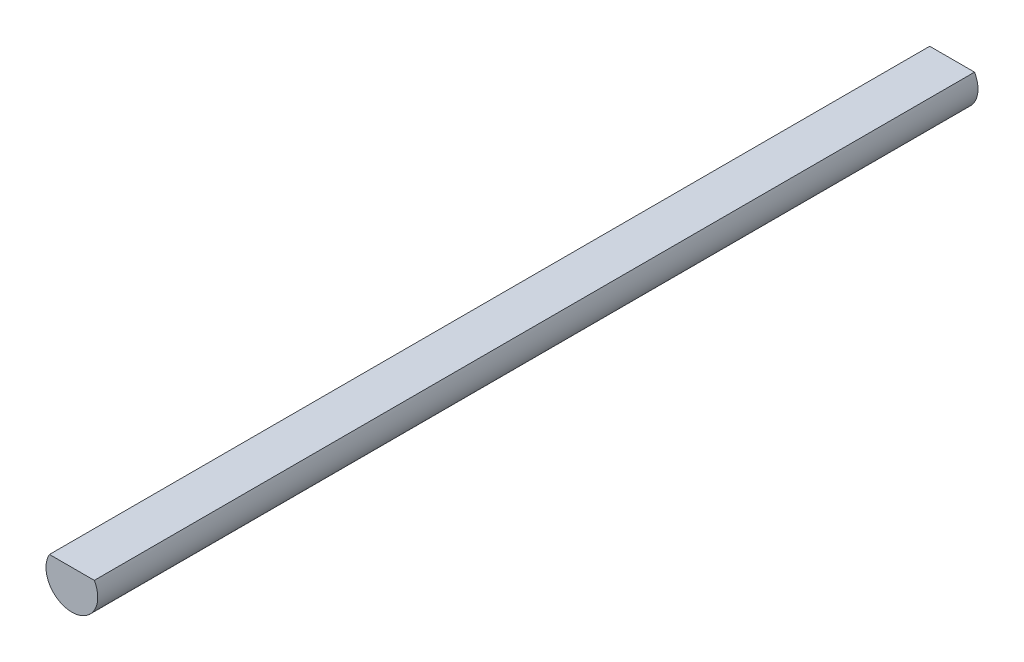
ISO-10303-21;
HEADER;
FILE_DESCRIPTION(('STEP AP214'),'2;1');
FILE_NAME('part.step','',(''),(''),'','','');
FILE_SCHEMA(('AUTOMOTIVE_DESIGN { 1 0 10303 214 1 1 1 1 }'));
ENDSEC;
DATA;
#1=APPLICATION_CONTEXT('core data for automotive mechanical design processes');
#2=APPLICATION_PROTOCOL_DEFINITION('international standard','automotive_design',2000,#1);
#3=PRODUCT_CONTEXT('',#1,'mechanical');
#4=PRODUCT('Part','Part','',(#3));
#5=PRODUCT_RELATED_PRODUCT_CATEGORY('part','',(#4));
#6=PRODUCT_DEFINITION_FORMATION('','',#4);
#7=PRODUCT_DEFINITION_CONTEXT('part definition',#1,'design');
#8=PRODUCT_DEFINITION('design','',#6,#7);
#9=PRODUCT_DEFINITION_SHAPE('','',#8);
#10=(LENGTH_UNIT() NAMED_UNIT(*) SI_UNIT(.MILLI.,.METRE.));
#11=(NAMED_UNIT(*) PLANE_ANGLE_UNIT() SI_UNIT($,.RADIAN.));
#12=(NAMED_UNIT(*) SI_UNIT($,.STERADIAN.) SOLID_ANGLE_UNIT());
#13=UNCERTAINTY_MEASURE_WITH_UNIT(LENGTH_MEASURE(1.E-05),#10,'distance_accuracy_value','');
#14=(GEOMETRIC_REPRESENTATION_CONTEXT(3) GLOBAL_UNCERTAINTY_ASSIGNED_CONTEXT((#13)) GLOBAL_UNIT_ASSIGNED_CONTEXT((#10,
#11,#12)) REPRESENTATION_CONTEXT('',''));
#15=CARTESIAN_POINT('',(0.,0.,0.));
#16=DIRECTION('',(0.,0.,1.));
#17=DIRECTION('',(1.,0.,0.));
#18=AXIS2_PLACEMENT_3D('',#15,#16,#17);
#19=CARTESIAN_POINT('',(-5.4991,3.17527938770748,215.9));
#20=DIRECTION('',(0.,1.,0.));
#21=DIRECTION('',(0.,0.,1.));
#22=AXIS2_PLACEMENT_3D('',#19,#20,#21);
#23=PLANE('',#22);
#24=DIRECTION('',(1.,0.,0.));
#25=VECTOR('',#24,1.);
#26=CARTESIAN_POINT('',(-5.4991,3.17527938770748,0.));
#27=LINE('',#26,#25);
#28=CARTESIAN_POINT('',(-5.4991,3.17527938770748,0.));
#29=VERTEX_POINT('',#28);
#30=CARTESIAN_POINT('',(5.4991,3.17527938770748,0.));
#31=VERTEX_POINT('',#30);
#32=EDGE_CURVE('E64',#29,#31,#27,.T.);
#33=ORIENTED_EDGE('',*,*,#32,.F.);
#34=DIRECTION('',(0.,0.,-1.));
#35=VECTOR('',#34,1.);
#36=CARTESIAN_POINT('',(-5.4991,3.17527938770748,215.9));
#37=LINE('',#36,#35);
#38=CARTESIAN_POINT('',(-5.4991,3.17527938770748,215.9));
#39=VERTEX_POINT('',#38);
#40=EDGE_CURVE('E11',#39,#29,#37,.T.);
#41=ORIENTED_EDGE('',*,*,#40,.F.);
#42=DIRECTION('',(1.,0.,0.));
#43=VECTOR('',#42,1.);
#44=CARTESIAN_POINT('',(-5.4991,3.17527938770748,215.9));
#45=LINE('',#44,#43);
#46=CARTESIAN_POINT('',(5.4991,3.17527938770748,215.9));
#47=VERTEX_POINT('',#46);
#48=EDGE_CURVE('E65',#39,#47,#45,.T.);
#49=ORIENTED_EDGE('',*,*,#48,.T.);
#50=DIRECTION('',(0.,0.,-1.));
#51=VECTOR('',#50,1.);
#52=CARTESIAN_POINT('',(5.4991,3.17527938770748,215.9));
#53=LINE('',#52,#51);
#54=EDGE_CURVE('E36',#47,#31,#53,.T.);
#55=ORIENTED_EDGE('',*,*,#54,.T.);
#56=EDGE_LOOP('',(#33,#41,#49,#55));
#57=FACE_BOUND('',#56,.T.);
#58=ADVANCED_FACE('F33',(#57),#23,.T.);
#59=CARTESIAN_POINT('',(0.,0.,215.9));
#60=DIRECTION('',(0.,0.,-1.));
#61=DIRECTION('',(-1.,0.,0.));
#62=AXIS2_PLACEMENT_3D('',#59,#60,#61);
#63=CYLINDRICAL_SURFACE('',#62,6.35);
#64=CARTESIAN_POINT('',(0.,0.,0.));
#65=DIRECTION('',(0.,0.,1.));
#66=DIRECTION('',(1.,0.,0.));
#67=AXIS2_PLACEMENT_3D('',#64,#65,#66);
#68=CIRCLE('',#67,6.35);
#69=EDGE_CURVE('E58',#29,#31,#68,.T.);
#70=ORIENTED_EDGE('',*,*,#69,.T.);
#71=ORIENTED_EDGE('',*,*,#54,.F.);
#72=CARTESIAN_POINT('',(0.,0.,215.9));
#73=DIRECTION('',(0.,0.,1.));
#74=DIRECTION('',(1.,0.,0.));
#75=AXIS2_PLACEMENT_3D('',#72,#73,#74);
#76=CIRCLE('',#75,6.35);
#77=EDGE_CURVE('E60',#39,#47,#76,.T.);
#78=ORIENTED_EDGE('',*,*,#77,.F.);
#79=ORIENTED_EDGE('',*,*,#40,.T.);
#80=EDGE_LOOP('',(#70,#71,#78,#79));
#81=FACE_BOUND('',#80,.T.);
#82=ADVANCED_FACE('F57',(#81),#63,.T.);
#83=CARTESIAN_POINT('',(0.,0.,215.9));
#84=DIRECTION('',(0.,0.,1.));
#85=DIRECTION('',(1.,0.,0.));
#86=AXIS2_PLACEMENT_3D('',#83,#84,#85);
#87=PLANE('',#86);
#88=ORIENTED_EDGE('',*,*,#48,.F.);
#89=ORIENTED_EDGE('',*,*,#77,.T.);
#90=EDGE_LOOP('',(#88,#89));
#91=FACE_BOUND('',#90,.T.);
#92=ADVANCED_FACE('F71',(#91),#87,.T.);
#93=CARTESIAN_POINT('',(0.,0.,0.));
#94=DIRECTION('',(0.,0.,1.));
#95=DIRECTION('',(1.,0.,0.));
#96=AXIS2_PLACEMENT_3D('',#93,#94,#95);
#97=PLANE('',#96);
#98=ORIENTED_EDGE('',*,*,#32,.T.);
#99=ORIENTED_EDGE('',*,*,#69,.F.);
#100=EDGE_LOOP('',(#98,#99));
#101=FACE_BOUND('',#100,.T.);
#102=ADVANCED_FACE('F63',(#101),#97,.F.);
#103=CLOSED_SHELL('',(#58,#82,#92,#102));
#104=MANIFOLD_SOLID_BREP('B2',#103);
#105=ADVANCED_BREP_SHAPE_REPRESENTATION('',(#18,#104),#14);
#106=SHAPE_DEFINITION_REPRESENTATION(#9,#105);
ENDSEC;
END-ISO-10303-21;
